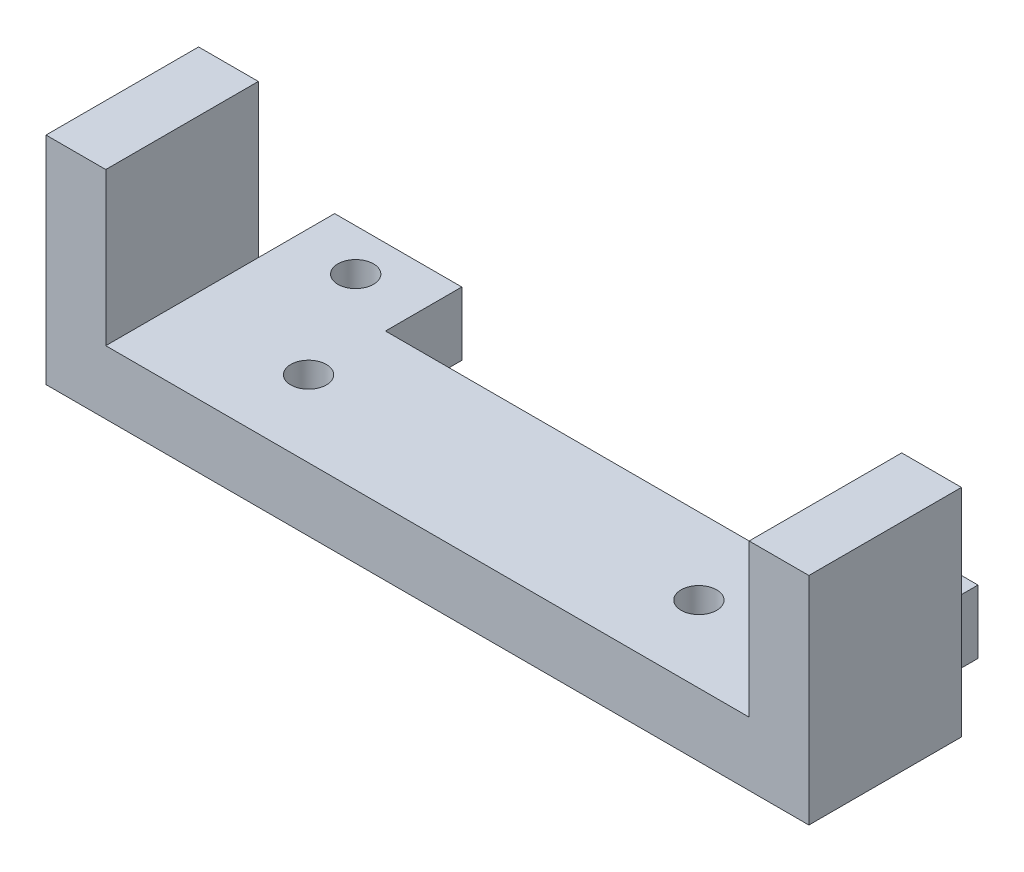
ISO-10303-21;
HEADER;
FILE_DESCRIPTION(('STEP AP214'),'2;1');
FILE_NAME('part.step','',(''),(''),'','','');
FILE_SCHEMA(('AUTOMOTIVE_DESIGN { 1 0 10303 214 1 1 1 1 }'));
ENDSEC;
DATA;
#1=APPLICATION_CONTEXT('core data for automotive mechanical design processes');
#2=APPLICATION_PROTOCOL_DEFINITION('international standard','automotive_design',2000,#1);
#3=PRODUCT_CONTEXT('',#1,'mechanical');
#4=PRODUCT('Part','Part','',(#3));
#5=PRODUCT_RELATED_PRODUCT_CATEGORY('part','',(#4));
#6=PRODUCT_DEFINITION_FORMATION('','',#4);
#7=PRODUCT_DEFINITION_CONTEXT('part definition',#1,'design');
#8=PRODUCT_DEFINITION('design','',#6,#7);
#9=PRODUCT_DEFINITION_SHAPE('','',#8);
#10=(LENGTH_UNIT() NAMED_UNIT(*) SI_UNIT(.MILLI.,.METRE.));
#11=(NAMED_UNIT(*) PLANE_ANGLE_UNIT() SI_UNIT($,.RADIAN.));
#12=(NAMED_UNIT(*) SI_UNIT($,.STERADIAN.) SOLID_ANGLE_UNIT());
#13=UNCERTAINTY_MEASURE_WITH_UNIT(LENGTH_MEASURE(1.E-05),#10,'distance_accuracy_value','');
#14=(GEOMETRIC_REPRESENTATION_CONTEXT(3) GLOBAL_UNCERTAINTY_ASSIGNED_CONTEXT((#13)) GLOBAL_UNIT_ASSIGNED_CONTEXT((#10,
#11,#12)) REPRESENTATION_CONTEXT('',''));
#15=CARTESIAN_POINT('',(0.,0.,0.));
#16=DIRECTION('',(0.,0.,1.));
#17=DIRECTION('',(1.,0.,0.));
#18=AXIS2_PLACEMENT_3D('',#15,#16,#17);
#19=CARTESIAN_POINT('',(-30.,5.,-6.));
#20=DIRECTION('',(0.,0.,1.));
#21=DIRECTION('',(1.,0.,0.));
#22=AXIS2_PLACEMENT_3D('',#19,#20,#21);
#23=PLANE('',#22);
#24=DIRECTION('',(0.,1.,0.));
#25=VECTOR('',#24,1.);
#26=CARTESIAN_POINT('',(-25.3,0.,-6.));
#27=LINE('',#26,#25);
#28=CARTESIAN_POINT('',(-25.3,0.,-6.));
#29=VERTEX_POINT('',#28);
#30=CARTESIAN_POINT('',(-25.3,5.,-6.));
#31=VERTEX_POINT('',#30);
#32=EDGE_CURVE('E153',#29,#31,#27,.T.);
#33=ORIENTED_EDGE('',*,*,#32,.F.);
#34=DIRECTION('',(-1.,0.,0.));
#35=VECTOR('',#34,1.);
#36=CARTESIAN_POINT('',(-30.,0.,-6.));
#37=LINE('',#36,#35);
#38=CARTESIAN_POINT('',(-30.,0.,-6.));
#39=VERTEX_POINT('',#38);
#40=EDGE_CURVE('E164',#29,#39,#37,.T.);
#41=ORIENTED_EDGE('',*,*,#40,.T.);
#42=DIRECTION('',(0.,-1.,0.));
#43=VECTOR('',#42,1.);
#44=CARTESIAN_POINT('',(-30.,5.,-6.));
#45=LINE('',#44,#43);
#46=CARTESIAN_POINT('',(-30.,17.,-6.));
#47=VERTEX_POINT('',#46);
#48=EDGE_CURVE('E200',#47,#39,#45,.T.);
#49=ORIENTED_EDGE('',*,*,#48,.F.);
#50=DIRECTION('',(-1.,0.,0.));
#51=VECTOR('',#50,1.);
#52=CARTESIAN_POINT('',(-30.,17.,-6.));
#53=LINE('',#52,#51);
#54=CARTESIAN_POINT('',(-25.3,17.,-6.));
#55=VERTEX_POINT('',#54);
#56=EDGE_CURVE('E251',#55,#47,#53,.T.);
#57=ORIENTED_EDGE('',*,*,#56,.F.);
#58=DIRECTION('',(0.,-1.,0.));
#59=VECTOR('',#58,1.);
#60=CARTESIAN_POINT('',(-25.3,17.,-6.));
#61=LINE('',#60,#59);
#62=EDGE_CURVE('E169',#55,#31,#61,.T.);
#63=ORIENTED_EDGE('',*,*,#62,.T.);
#64=EDGE_LOOP('',(#33,#41,#49,#57,#63));
#65=FACE_BOUND('',#64,.T.);
#66=ADVANCED_FACE('F43',(#65),#23,.F.);
#67=CARTESIAN_POINT('',(15.3,0.,-6.));
#68=VERTEX_POINT('',#67);
#69=CARTESIAN_POINT('',(-15.3,0.,-6.));
#70=VERTEX_POINT('',#69);
#71=EDGE_CURVE('E180',#68,#70,#37,.T.);
#72=ORIENTED_EDGE('',*,*,#71,.T.);
#73=DIRECTION('',(0.,1.,0.));
#74=VECTOR('',#73,1.);
#75=CARTESIAN_POINT('',(-15.3,0.,-6.));
#76=LINE('',#75,#74);
#77=CARTESIAN_POINT('',(-15.3,5.,-6.));
#78=VERTEX_POINT('',#77);
#79=EDGE_CURVE('E167',#70,#78,#76,.T.);
#80=ORIENTED_EDGE('',*,*,#79,.T.);
#81=DIRECTION('',(-1.,0.,0.));
#82=VECTOR('',#81,1.);
#83=CARTESIAN_POINT('',(-30.,5.,-6.));
#84=LINE('',#83,#82);
#85=CARTESIAN_POINT('',(15.3,5.,-6.));
#86=VERTEX_POINT('',#85);
#87=EDGE_CURVE('E188',#86,#78,#84,.T.);
#88=ORIENTED_EDGE('',*,*,#87,.F.);
#89=DIRECTION('',(0.,1.,0.));
#90=VECTOR('',#89,1.);
#91=CARTESIAN_POINT('',(15.3,0.,-6.));
#92=LINE('',#91,#90);
#93=EDGE_CURVE('E292',#68,#86,#92,.T.);
#94=ORIENTED_EDGE('',*,*,#93,.F.);
#95=EDGE_LOOP('',(#72,#80,#88,#94));
#96=FACE_BOUND('',#95,.T.);
#97=ADVANCED_FACE('F314',(#96),#23,.F.);
#98=CARTESIAN_POINT('',(-30.,5.,-6.));
#99=DIRECTION('',(1.,0.,0.));
#100=DIRECTION('',(0.,0.,-1.));
#101=AXIS2_PLACEMENT_3D('',#98,#99,#100);
#102=PLANE('',#101);
#103=DIRECTION('',(0.,0.,1.));
#104=VECTOR('',#103,1.);
#105=CARTESIAN_POINT('',(-30.,0.,-6.));
#106=LINE('',#105,#104);
#107=CARTESIAN_POINT('',(-30.,0.,6.));
#108=VERTEX_POINT('',#107);
#109=EDGE_CURVE('E176',#39,#108,#106,.T.);
#110=ORIENTED_EDGE('',*,*,#109,.T.);
#111=DIRECTION('',(0.,-1.,0.));
#112=VECTOR('',#111,1.);
#113=CARTESIAN_POINT('',(-30.,5.,6.));
#114=LINE('',#113,#112);
#115=CARTESIAN_POINT('',(-30.,17.,6.));
#116=VERTEX_POINT('',#115);
#117=EDGE_CURVE('E11',#116,#108,#114,.T.);
#118=ORIENTED_EDGE('',*,*,#117,.F.);
#119=DIRECTION('',(0.,0.,1.));
#120=VECTOR('',#119,1.);
#121=CARTESIAN_POINT('',(-30.,17.,-6.));
#122=LINE('',#121,#120);
#123=EDGE_CURVE('E246',#47,#116,#122,.T.);
#124=ORIENTED_EDGE('',*,*,#123,.F.);
#125=ORIENTED_EDGE('',*,*,#48,.T.);
#126=EDGE_LOOP('',(#110,#118,#124,#125));
#127=FACE_BOUND('',#126,.T.);
#128=ADVANCED_FACE('F44',(#127),#102,.F.);
#129=CARTESIAN_POINT('',(-30.,5.,6.));
#130=DIRECTION('',(0.,0.,-1.));
#131=DIRECTION('',(-1.,0.,0.));
#132=AXIS2_PLACEMENT_3D('',#129,#130,#131);
#133=PLANE('',#132);
#134=DIRECTION('',(1.,0.,0.));
#135=VECTOR('',#134,1.);
#136=CARTESIAN_POINT('',(-30.,0.,6.));
#137=LINE('',#136,#135);
#138=CARTESIAN_POINT('',(30.,0.,6.));
#139=VERTEX_POINT('',#138);
#140=EDGE_CURVE('E185',#108,#139,#137,.T.);
#141=ORIENTED_EDGE('',*,*,#140,.T.);
#142=DIRECTION('',(0.,-1.,0.));
#143=VECTOR('',#142,1.);
#144=CARTESIAN_POINT('',(30.,5.,6.));
#145=LINE('',#144,#143);
#146=CARTESIAN_POINT('',(30.,17.,6.));
#147=VERTEX_POINT('',#146);
#148=EDGE_CURVE('E51',#147,#139,#145,.T.);
#149=ORIENTED_EDGE('',*,*,#148,.F.);
#150=DIRECTION('',(1.,0.,0.));
#151=VECTOR('',#150,1.);
#152=CARTESIAN_POINT('',(25.3,17.,6.));
#153=LINE('',#152,#151);
#154=CARTESIAN_POINT('',(25.3,17.,6.));
#155=VERTEX_POINT('',#154);
#156=EDGE_CURVE('E272',#155,#147,#153,.T.);
#157=ORIENTED_EDGE('',*,*,#156,.F.);
#158=DIRECTION('',(0.,-1.,0.));
#159=VECTOR('',#158,1.);
#160=CARTESIAN_POINT('',(25.3,17.,6.));
#161=LINE('',#160,#159);
#162=CARTESIAN_POINT('',(25.3,5.,6.));
#163=VERTEX_POINT('',#162);
#164=EDGE_CURVE('E244',#155,#163,#161,.T.);
#165=ORIENTED_EDGE('',*,*,#164,.T.);
#166=DIRECTION('',(1.,0.,0.));
#167=VECTOR('',#166,1.);
#168=CARTESIAN_POINT('',(-30.,5.,6.));
#169=LINE('',#168,#167);
#170=CARTESIAN_POINT('',(-25.3,5.,6.));
#171=VERTEX_POINT('',#170);
#172=EDGE_CURVE('E187',#171,#163,#169,.T.);
#173=ORIENTED_EDGE('',*,*,#172,.F.);
#174=DIRECTION('',(0.,-1.,0.));
#175=VECTOR('',#174,1.);
#176=CARTESIAN_POINT('',(-25.3,17.,6.));
#177=LINE('',#176,#175);
#178=CARTESIAN_POINT('',(-25.3,17.,6.));
#179=VERTEX_POINT('',#178);
#180=EDGE_CURVE('E203',#179,#171,#177,.T.);
#181=ORIENTED_EDGE('',*,*,#180,.F.);
#182=DIRECTION('',(1.,0.,0.));
#183=VECTOR('',#182,1.);
#184=CARTESIAN_POINT('',(-30.,17.,6.));
#185=LINE('',#184,#183);
#186=EDGE_CURVE('E248',#116,#179,#185,.T.);
#187=ORIENTED_EDGE('',*,*,#186,.F.);
#188=ORIENTED_EDGE('',*,*,#117,.T.);
#189=EDGE_LOOP('',(#141,#149,#157,#165,#173,#181,#187,#188));
#190=FACE_BOUND('',#189,.T.);
#191=ADVANCED_FACE('F210',(#190),#133,.F.);
#192=CARTESIAN_POINT('',(30.,5.,-6.));
#193=DIRECTION('',(-1.,0.,0.));
#194=DIRECTION('',(0.,0.,1.));
#195=AXIS2_PLACEMENT_3D('',#192,#193,#194);
#196=PLANE('',#195);
#197=DIRECTION('',(0.,0.,-1.));
#198=VECTOR('',#197,1.);
#199=CARTESIAN_POINT('',(30.,0.,-6.));
#200=LINE('',#199,#198);
#201=CARTESIAN_POINT('',(30.,0.,-6.));
#202=VERTEX_POINT('',#201);
#203=EDGE_CURVE('E178',#139,#202,#200,.T.);
#204=ORIENTED_EDGE('',*,*,#203,.T.);
#205=DIRECTION('',(0.,-1.,0.));
#206=VECTOR('',#205,1.);
#207=CARTESIAN_POINT('',(30.,5.,-6.));
#208=LINE('',#207,#206);
#209=CARTESIAN_POINT('',(30.,17.,-6.));
#210=VERTEX_POINT('',#209);
#211=EDGE_CURVE('E217',#210,#202,#208,.T.);
#212=ORIENTED_EDGE('',*,*,#211,.F.);
#213=DIRECTION('',(0.,0.,-1.));
#214=VECTOR('',#213,1.);
#215=CARTESIAN_POINT('',(30.,17.,-6.));
#216=LINE('',#215,#214);
#217=EDGE_CURVE('E213',#147,#210,#216,.T.);
#218=ORIENTED_EDGE('',*,*,#217,.F.);
#219=ORIENTED_EDGE('',*,*,#148,.T.);
#220=EDGE_LOOP('',(#204,#212,#218,#219));
#221=FACE_BOUND('',#220,.T.);
#222=ADVANCED_FACE('F214',(#221),#196,.F.);
#223=CARTESIAN_POINT('',(25.3,0.,-6.));
#224=VERTEX_POINT('',#223);
#225=EDGE_CURVE('E179',#202,#224,#37,.T.);
#226=ORIENTED_EDGE('',*,*,#225,.T.);
#227=DIRECTION('',(0.,1.,0.));
#228=VECTOR('',#227,1.);
#229=CARTESIAN_POINT('',(25.3,0.,-6.));
#230=LINE('',#229,#228);
#231=CARTESIAN_POINT('',(25.3,5.,-6.));
#232=VERTEX_POINT('',#231);
#233=EDGE_CURVE('E293',#224,#232,#230,.T.);
#234=ORIENTED_EDGE('',*,*,#233,.T.);
#235=DIRECTION('',(0.,-1.,0.));
#236=VECTOR('',#235,1.);
#237=CARTESIAN_POINT('',(25.3,17.,-6.));
#238=LINE('',#237,#236);
#239=CARTESIAN_POINT('',(25.3,17.,-6.));
#240=VERTEX_POINT('',#239);
#241=EDGE_CURVE('E264',#240,#232,#238,.T.);
#242=ORIENTED_EDGE('',*,*,#241,.F.);
#243=DIRECTION('',(-1.,0.,0.));
#244=VECTOR('',#243,1.);
#245=CARTESIAN_POINT('',(25.3,17.,-6.));
#246=LINE('',#245,#244);
#247=EDGE_CURVE('E267',#210,#240,#246,.T.);
#248=ORIENTED_EDGE('',*,*,#247,.F.);
#249=ORIENTED_EDGE('',*,*,#211,.T.);
#250=EDGE_LOOP('',(#226,#234,#242,#248,#249));
#251=FACE_BOUND('',#250,.T.);
#252=ADVANCED_FACE('F290',(#251),#23,.F.);
#253=CARTESIAN_POINT('',(0.,5.,0.));
#254=DIRECTION('',(0.,1.,0.));
#255=DIRECTION('',(0.,0.,1.));
#256=AXIS2_PLACEMENT_3D('',#253,#254,#255);
#257=PLANE('',#256);
#258=CARTESIAN_POINT('',(-20.35,5.,-8.70662265696385));
#259=DIRECTION('',(0.,1.,0.));
#260=DIRECTION('',(0.,0.,1.));
#261=AXIS2_PLACEMENT_3D('',#258,#259,#260);
#262=CIRCLE('',#261,1.39999999999999);
#263=CARTESIAN_POINT('',(-20.35,5.,-7.30662265696386));
#264=VERTEX_POINT('',#263);
#265=EDGE_CURVE('E332',#264,#264,#262,.T.);
#266=ORIENTED_EDGE('',*,*,#265,.F.);
#267=EDGE_LOOP('',(#266));
#268=FACE_BOUND('',#267,.T.);
#269=CARTESIAN_POINT('',(20.35,5.,-8.70662265696385));
#270=DIRECTION('',(0.,1.,0.));
#271=DIRECTION('',(0.,0.,1.));
#272=AXIS2_PLACEMENT_3D('',#269,#270,#271);
#273=CIRCLE('',#272,1.39999999999999);
#274=CARTESIAN_POINT('',(20.35,5.,-7.30662265696386));
#275=VERTEX_POINT('',#274);
#276=EDGE_CURVE('E291',#275,#275,#273,.T.);
#277=ORIENTED_EDGE('',*,*,#276,.F.);
#278=EDGE_LOOP('',(#277));
#279=FACE_BOUND('',#278,.T.);
#280=CARTESIAN_POINT('',(15.35,5.,0.));
#281=DIRECTION('',(0.,1.,0.));
#282=DIRECTION('',(0.,0.,1.));
#283=AXIS2_PLACEMENT_3D('',#280,#281,#282);
#284=CIRCLE('',#283,1.39999999999999);
#285=CARTESIAN_POINT('',(15.35,5.,1.39999999999999));
#286=VERTEX_POINT('',#285);
#287=EDGE_CURVE('E236',#286,#286,#284,.T.);
#288=ORIENTED_EDGE('',*,*,#287,.F.);
#289=EDGE_LOOP('',(#288));
#290=FACE_BOUND('',#289,.T.);
#291=CARTESIAN_POINT('',(-15.35,5.,0.));
#292=DIRECTION('',(0.,1.,0.));
#293=DIRECTION('',(0.,0.,1.));
#294=AXIS2_PLACEMENT_3D('',#291,#292,#293);
#295=CIRCLE('',#294,1.39999999999999);
#296=CARTESIAN_POINT('',(-15.35,5.,1.39999999999999));
#297=VERTEX_POINT('',#296);
#298=EDGE_CURVE('E245',#297,#297,#295,.T.);
#299=ORIENTED_EDGE('',*,*,#298,.F.);
#300=EDGE_LOOP('',(#299));
#301=FACE_BOUND('',#300,.T.);
#302=DIRECTION('',(0.,0.,-1.));
#303=VECTOR('',#302,1.);
#304=CARTESIAN_POINT('',(-25.3,5.,-6.));
#305=LINE('',#304,#303);
#306=EDGE_CURVE('E249',#171,#31,#305,.T.);
#307=ORIENTED_EDGE('',*,*,#306,.F.);
#308=ORIENTED_EDGE('',*,*,#172,.T.);
#309=DIRECTION('',(0.,0.,1.));
#310=VECTOR('',#309,1.);
#311=CARTESIAN_POINT('',(25.3,5.,-6.));
#312=LINE('',#311,#310);
#313=EDGE_CURVE('E256',#232,#163,#312,.T.);
#314=ORIENTED_EDGE('',*,*,#313,.F.);
#315=DIRECTION('',(0.,0.,-1.));
#316=VECTOR('',#315,1.);
#317=CARTESIAN_POINT('',(25.3,5.,-6.));
#318=LINE('',#317,#316);
#319=CARTESIAN_POINT('',(25.3,5.,-12.));
#320=VERTEX_POINT('',#319);
#321=EDGE_CURVE('E67',#232,#320,#318,.T.);
#322=ORIENTED_EDGE('',*,*,#321,.T.);
#323=DIRECTION('',(-1.,0.,0.));
#324=VECTOR('',#323,1.);
#325=CARTESIAN_POINT('',(25.3,5.,-12.));
#326=LINE('',#325,#324);
#327=CARTESIAN_POINT('',(15.3,5.,-12.));
#328=VERTEX_POINT('',#327);
#329=EDGE_CURVE('E227',#320,#328,#326,.T.);
#330=ORIENTED_EDGE('',*,*,#329,.T.);
#331=DIRECTION('',(0.,0.,1.));
#332=VECTOR('',#331,1.);
#333=CARTESIAN_POINT('',(15.3,5.,-6.));
#334=LINE('',#333,#332);
#335=EDGE_CURVE('E223',#328,#86,#334,.T.);
#336=ORIENTED_EDGE('',*,*,#335,.T.);
#337=ORIENTED_EDGE('',*,*,#87,.T.);
#338=DIRECTION('',(0.,0.,-1.));
#339=VECTOR('',#338,1.);
#340=CARTESIAN_POINT('',(-15.3,5.,-6.));
#341=LINE('',#340,#339);
#342=CARTESIAN_POINT('',(-15.3,5.,-12.));
#343=VERTEX_POINT('',#342);
#344=EDGE_CURVE('E59',#78,#343,#341,.T.);
#345=ORIENTED_EDGE('',*,*,#344,.T.);
#346=DIRECTION('',(-1.,0.,0.));
#347=VECTOR('',#346,1.);
#348=CARTESIAN_POINT('',(-25.3,5.,-12.));
#349=LINE('',#348,#347);
#350=CARTESIAN_POINT('',(-25.3,5.,-12.));
#351=VERTEX_POINT('',#350);
#352=EDGE_CURVE('E163',#343,#351,#349,.T.);
#353=ORIENTED_EDGE('',*,*,#352,.T.);
#354=DIRECTION('',(0.,0.,1.));
#355=VECTOR('',#354,1.);
#356=CARTESIAN_POINT('',(-25.3,5.,-6.));
#357=LINE('',#356,#355);
#358=EDGE_CURVE('E296',#351,#31,#357,.T.);
#359=ORIENTED_EDGE('',*,*,#358,.T.);
#360=EDGE_LOOP('',(#307,#308,#314,#322,#330,#336,#337,#345,#353,#359));
#361=FACE_BOUND('',#360,.T.);
#362=ADVANCED_FACE('F294',(#268,#279,#290,#301,#361),#257,.T.);
#363=CARTESIAN_POINT('',(0.,0.,0.));
#364=DIRECTION('',(0.,1.,0.));
#365=DIRECTION('',(0.,0.,1.));
#366=AXIS2_PLACEMENT_3D('',#363,#364,#365);
#367=PLANE('',#366);
#368=CARTESIAN_POINT('',(-20.35,0.,-8.70662265696385));
#369=DIRECTION('',(0.,-1.,0.));
#370=DIRECTION('',(0.,0.,-1.));
#371=AXIS2_PLACEMENT_3D('',#368,#369,#370);
#372=CIRCLE('',#371,1.39999999999999);
#373=CARTESIAN_POINT('',(-20.35,0.,-10.1066226569638));
#374=VERTEX_POINT('',#373);
#375=EDGE_CURVE('E335',#374,#374,#372,.T.);
#376=ORIENTED_EDGE('',*,*,#375,.F.);
#377=EDGE_LOOP('',(#376));
#378=FACE_BOUND('',#377,.T.);
#379=CARTESIAN_POINT('',(20.35,0.,-8.70662265696385));
#380=DIRECTION('',(0.,-1.,0.));
#381=DIRECTION('',(0.,0.,-1.));
#382=AXIS2_PLACEMENT_3D('',#379,#380,#381);
#383=CIRCLE('',#382,1.39999999999999);
#384=CARTESIAN_POINT('',(20.35,0.,-10.1066226569638));
#385=VERTEX_POINT('',#384);
#386=EDGE_CURVE('E329',#385,#385,#383,.T.);
#387=ORIENTED_EDGE('',*,*,#386,.F.);
#388=EDGE_LOOP('',(#387));
#389=FACE_BOUND('',#388,.T.);
#390=CARTESIAN_POINT('',(15.35,0.,0.));
#391=DIRECTION('',(0.,-1.,0.));
#392=DIRECTION('',(0.,0.,-1.));
#393=AXIS2_PLACEMENT_3D('',#390,#391,#392);
#394=CIRCLE('',#393,1.39999999999999);
#395=CARTESIAN_POINT('',(15.35,0.,-1.39999999999999));
#396=VERTEX_POINT('',#395);
#397=EDGE_CURVE('E231',#396,#396,#394,.T.);
#398=ORIENTED_EDGE('',*,*,#397,.F.);
#399=EDGE_LOOP('',(#398));
#400=FACE_BOUND('',#399,.T.);
#401=CARTESIAN_POINT('',(-15.35,0.,0.));
#402=DIRECTION('',(0.,-1.,0.));
#403=DIRECTION('',(0.,0.,-1.));
#404=AXIS2_PLACEMENT_3D('',#401,#402,#403);
#405=CIRCLE('',#404,1.39999999999999);
#406=CARTESIAN_POINT('',(-15.35,0.,-1.39999999999999));
#407=VERTEX_POINT('',#406);
#408=EDGE_CURVE('E237',#407,#407,#405,.T.);
#409=ORIENTED_EDGE('',*,*,#408,.F.);
#410=EDGE_LOOP('',(#409));
#411=FACE_BOUND('',#410,.T.);
#412=ORIENTED_EDGE('',*,*,#109,.F.);
#413=ORIENTED_EDGE('',*,*,#40,.F.);
#414=DIRECTION('',(0.,0.,1.));
#415=VECTOR('',#414,1.);
#416=CARTESIAN_POINT('',(-25.3,0.,-6.));
#417=LINE('',#416,#415);
#418=CARTESIAN_POINT('',(-25.3,0.,-12.));
#419=VERTEX_POINT('',#418);
#420=EDGE_CURVE('E146',#419,#29,#417,.T.);
#421=ORIENTED_EDGE('',*,*,#420,.F.);
#422=DIRECTION('',(-1.,0.,0.));
#423=VECTOR('',#422,1.);
#424=CARTESIAN_POINT('',(-25.3,0.,-12.));
#425=LINE('',#424,#423);
#426=CARTESIAN_POINT('',(-15.3,0.,-12.));
#427=VERTEX_POINT('',#426);
#428=EDGE_CURVE('E171',#427,#419,#425,.T.);
#429=ORIENTED_EDGE('',*,*,#428,.F.);
#430=DIRECTION('',(0.,0.,-1.));
#431=VECTOR('',#430,1.);
#432=CARTESIAN_POINT('',(-15.3,0.,-6.));
#433=LINE('',#432,#431);
#434=EDGE_CURVE('E160',#70,#427,#433,.T.);
#435=ORIENTED_EDGE('',*,*,#434,.F.);
#436=ORIENTED_EDGE('',*,*,#71,.F.);
#437=DIRECTION('',(0.,0.,1.));
#438=VECTOR('',#437,1.);
#439=CARTESIAN_POINT('',(15.3,0.,-6.));
#440=LINE('',#439,#438);
#441=CARTESIAN_POINT('',(15.3,0.,-12.));
#442=VERTEX_POINT('',#441);
#443=EDGE_CURVE('E230',#442,#68,#440,.T.);
#444=ORIENTED_EDGE('',*,*,#443,.F.);
#445=DIRECTION('',(-1.,0.,0.));
#446=VECTOR('',#445,1.);
#447=CARTESIAN_POINT('',(25.3,0.,-12.));
#448=LINE('',#447,#446);
#449=CARTESIAN_POINT('',(25.3,0.,-12.));
#450=VERTEX_POINT('',#449);
#451=EDGE_CURVE('E224',#450,#442,#448,.T.);
#452=ORIENTED_EDGE('',*,*,#451,.F.);
#453=DIRECTION('',(0.,0.,-1.));
#454=VECTOR('',#453,1.);
#455=CARTESIAN_POINT('',(25.3,0.,-6.));
#456=LINE('',#455,#454);
#457=EDGE_CURVE('E216',#224,#450,#456,.T.);
#458=ORIENTED_EDGE('',*,*,#457,.F.);
#459=ORIENTED_EDGE('',*,*,#225,.F.);
#460=ORIENTED_EDGE('',*,*,#203,.F.);
#461=ORIENTED_EDGE('',*,*,#140,.F.);
#462=EDGE_LOOP('',(#412,#413,#421,#429,#435,#436,#444,#452,#458,#459,#460,#461));
#463=FACE_BOUND('',#462,.T.);
#464=ADVANCED_FACE('F172',(#378,#389,#400,#411,#463),#367,.F.);
#465=CARTESIAN_POINT('',(25.3,17.,-6.));
#466=DIRECTION('',(1.,0.,0.));
#467=DIRECTION('',(0.,0.,-1.));
#468=AXIS2_PLACEMENT_3D('',#465,#466,#467);
#469=PLANE('',#468);
#470=ORIENTED_EDGE('',*,*,#313,.T.);
#471=ORIENTED_EDGE('',*,*,#164,.F.);
#472=DIRECTION('',(0.,0.,1.));
#473=VECTOR('',#472,1.);
#474=CARTESIAN_POINT('',(25.3,17.,-6.));
#475=LINE('',#474,#473);
#476=EDGE_CURVE('E196',#240,#155,#475,.T.);
#477=ORIENTED_EDGE('',*,*,#476,.F.);
#478=ORIENTED_EDGE('',*,*,#241,.T.);
#479=EDGE_LOOP('',(#470,#471,#477,#478));
#480=FACE_BOUND('',#479,.T.);
#481=ADVANCED_FACE('F278',(#480),#469,.F.);
#482=CARTESIAN_POINT('',(0.,17.,0.));
#483=DIRECTION('',(0.,1.,0.));
#484=DIRECTION('',(0.,0.,1.));
#485=AXIS2_PLACEMENT_3D('',#482,#483,#484);
#486=PLANE('',#485);
#487=ORIENTED_EDGE('',*,*,#476,.T.);
#488=ORIENTED_EDGE('',*,*,#156,.T.);
#489=ORIENTED_EDGE('',*,*,#217,.T.);
#490=ORIENTED_EDGE('',*,*,#247,.T.);
#491=EDGE_LOOP('',(#487,#488,#489,#490));
#492=FACE_BOUND('',#491,.T.);
#493=ADVANCED_FACE('F277',(#492),#486,.T.);
#494=CARTESIAN_POINT('',(-25.3,17.,-6.));
#495=DIRECTION('',(-1.,0.,0.));
#496=DIRECTION('',(0.,0.,1.));
#497=AXIS2_PLACEMENT_3D('',#494,#495,#496);
#498=PLANE('',#497);
#499=ORIENTED_EDGE('',*,*,#306,.T.);
#500=ORIENTED_EDGE('',*,*,#62,.F.);
#501=DIRECTION('',(0.,0.,-1.));
#502=VECTOR('',#501,1.);
#503=CARTESIAN_POINT('',(-25.3,17.,-6.));
#504=LINE('',#503,#502);
#505=EDGE_CURVE('E255',#179,#55,#504,.T.);
#506=ORIENTED_EDGE('',*,*,#505,.F.);
#507=ORIENTED_EDGE('',*,*,#180,.T.);
#508=EDGE_LOOP('',(#499,#500,#506,#507));
#509=FACE_BOUND('',#508,.T.);
#510=ADVANCED_FACE('F284',(#509),#498,.F.);
#511=CARTESIAN_POINT('',(0.,17.,0.));
#512=DIRECTION('',(0.,1.,0.));
#513=DIRECTION('',(0.,0.,1.));
#514=AXIS2_PLACEMENT_3D('',#511,#512,#513);
#515=PLANE('',#514);
#516=ORIENTED_EDGE('',*,*,#123,.T.);
#517=ORIENTED_EDGE('',*,*,#186,.T.);
#518=ORIENTED_EDGE('',*,*,#505,.T.);
#519=ORIENTED_EDGE('',*,*,#56,.T.);
#520=EDGE_LOOP('',(#516,#517,#518,#519));
#521=FACE_BOUND('',#520,.T.);
#522=ADVANCED_FACE('F286',(#521),#515,.T.);
#523=CARTESIAN_POINT('',(-15.35,0.,0.));
#524=DIRECTION('',(0.,-1.,0.));
#525=DIRECTION('',(0.,0.,-1.));
#526=AXIS2_PLACEMENT_3D('',#523,#524,#525);
#527=CYLINDRICAL_SURFACE('',#526,1.39999999999999);
#528=ORIENTED_EDGE('',*,*,#298,.T.);
#529=EDGE_LOOP('',(#528));
#530=FACE_BOUND('',#529,.T.);
#531=ORIENTED_EDGE('',*,*,#408,.T.);
#532=EDGE_LOOP('',(#531));
#533=FACE_BOUND('',#532,.T.);
#534=ADVANCED_FACE('F346',(#530,#533),#527,.F.);
#535=CARTESIAN_POINT('',(15.35,0.,0.));
#536=DIRECTION('',(0.,-1.,0.));
#537=DIRECTION('',(0.,0.,-1.));
#538=AXIS2_PLACEMENT_3D('',#535,#536,#537);
#539=CYLINDRICAL_SURFACE('',#538,1.39999999999999);
#540=ORIENTED_EDGE('',*,*,#287,.T.);
#541=EDGE_LOOP('',(#540));
#542=FACE_BOUND('',#541,.T.);
#543=ORIENTED_EDGE('',*,*,#397,.T.);
#544=EDGE_LOOP('',(#543));
#545=FACE_BOUND('',#544,.T.);
#546=ADVANCED_FACE('F352',(#542,#545),#539,.F.);
#547=CARTESIAN_POINT('',(25.3,0.,-6.));
#548=DIRECTION('',(1.,0.,0.));
#549=DIRECTION('',(0.,0.,-1.));
#550=AXIS2_PLACEMENT_3D('',#547,#548,#549);
#551=PLANE('',#550);
#552=ORIENTED_EDGE('',*,*,#321,.F.);
#553=ORIENTED_EDGE('',*,*,#233,.F.);
#554=ORIENTED_EDGE('',*,*,#457,.T.);
#555=DIRECTION('',(0.,1.,0.));
#556=VECTOR('',#555,1.);
#557=CARTESIAN_POINT('',(25.3,0.,-12.));
#558=LINE('',#557,#556);
#559=EDGE_CURVE('E305',#450,#320,#558,.T.);
#560=ORIENTED_EDGE('',*,*,#559,.T.);
#561=EDGE_LOOP('',(#552,#553,#554,#560));
#562=FACE_BOUND('',#561,.T.);
#563=ADVANCED_FACE('F360',(#562),#551,.T.);
#564=CARTESIAN_POINT('',(15.3,0.,-6.));
#565=DIRECTION('',(-1.,0.,0.));
#566=DIRECTION('',(0.,0.,1.));
#567=AXIS2_PLACEMENT_3D('',#564,#565,#566);
#568=PLANE('',#567);
#569=ORIENTED_EDGE('',*,*,#335,.F.);
#570=DIRECTION('',(0.,1.,0.));
#571=VECTOR('',#570,1.);
#572=CARTESIAN_POINT('',(15.3,0.,-12.));
#573=LINE('',#572,#571);
#574=EDGE_CURVE('E304',#442,#328,#573,.T.);
#575=ORIENTED_EDGE('',*,*,#574,.F.);
#576=ORIENTED_EDGE('',*,*,#443,.T.);
#577=ORIENTED_EDGE('',*,*,#93,.T.);
#578=EDGE_LOOP('',(#569,#575,#576,#577));
#579=FACE_BOUND('',#578,.T.);
#580=ADVANCED_FACE('F311',(#579),#568,.T.);
#581=CARTESIAN_POINT('',(25.3,0.,-12.));
#582=DIRECTION('',(0.,0.,-1.));
#583=DIRECTION('',(-1.,0.,0.));
#584=AXIS2_PLACEMENT_3D('',#581,#582,#583);
#585=PLANE('',#584);
#586=ORIENTED_EDGE('',*,*,#329,.F.);
#587=ORIENTED_EDGE('',*,*,#559,.F.);
#588=ORIENTED_EDGE('',*,*,#451,.T.);
#589=ORIENTED_EDGE('',*,*,#574,.T.);
#590=EDGE_LOOP('',(#586,#587,#588,#589));
#591=FACE_BOUND('',#590,.T.);
#592=ADVANCED_FACE('F519',(#591),#585,.T.);
#593=CARTESIAN_POINT('',(-25.3,0.,-6.));
#594=DIRECTION('',(-1.,0.,0.));
#595=DIRECTION('',(0.,0.,1.));
#596=AXIS2_PLACEMENT_3D('',#593,#594,#595);
#597=PLANE('',#596);
#598=ORIENTED_EDGE('',*,*,#358,.F.);
#599=DIRECTION('',(0.,1.,0.));
#600=VECTOR('',#599,1.);
#601=CARTESIAN_POINT('',(-25.3,0.,-12.));
#602=LINE('',#601,#600);
#603=EDGE_CURVE('E151',#419,#351,#602,.T.);
#604=ORIENTED_EDGE('',*,*,#603,.F.);
#605=ORIENTED_EDGE('',*,*,#420,.T.);
#606=ORIENTED_EDGE('',*,*,#32,.T.);
#607=EDGE_LOOP('',(#598,#604,#605,#606));
#608=FACE_BOUND('',#607,.T.);
#609=ADVANCED_FACE('F155',(#608),#597,.T.);
#610=CARTESIAN_POINT('',(-25.3,0.,-12.));
#611=DIRECTION('',(0.,0.,-1.));
#612=DIRECTION('',(-1.,0.,0.));
#613=AXIS2_PLACEMENT_3D('',#610,#611,#612);
#614=PLANE('',#613);
#615=ORIENTED_EDGE('',*,*,#352,.F.);
#616=DIRECTION('',(0.,1.,0.));
#617=VECTOR('',#616,1.);
#618=CARTESIAN_POINT('',(-15.3,0.,-12.));
#619=LINE('',#618,#617);
#620=EDGE_CURVE('E319',#427,#343,#619,.T.);
#621=ORIENTED_EDGE('',*,*,#620,.F.);
#622=ORIENTED_EDGE('',*,*,#428,.T.);
#623=ORIENTED_EDGE('',*,*,#603,.T.);
#624=EDGE_LOOP('',(#615,#621,#622,#623));
#625=FACE_BOUND('',#624,.T.);
#626=ADVANCED_FACE('F537',(#625),#614,.T.);
#627=CARTESIAN_POINT('',(-15.3,0.,-6.));
#628=DIRECTION('',(1.,0.,0.));
#629=DIRECTION('',(0.,0.,-1.));
#630=AXIS2_PLACEMENT_3D('',#627,#628,#629);
#631=PLANE('',#630);
#632=ORIENTED_EDGE('',*,*,#344,.F.);
#633=ORIENTED_EDGE('',*,*,#79,.F.);
#634=ORIENTED_EDGE('',*,*,#434,.T.);
#635=ORIENTED_EDGE('',*,*,#620,.T.);
#636=EDGE_LOOP('',(#632,#633,#634,#635));
#637=FACE_BOUND('',#636,.T.);
#638=ADVANCED_FACE('F541',(#637),#631,.T.);
#639=CARTESIAN_POINT('',(20.35,0.,-8.70662265696385));
#640=DIRECTION('',(0.,-1.,0.));
#641=DIRECTION('',(0.,0.,-1.));
#642=AXIS2_PLACEMENT_3D('',#639,#640,#641);
#643=CYLINDRICAL_SURFACE('',#642,1.39999999999999);
#644=ORIENTED_EDGE('',*,*,#276,.T.);
#645=EDGE_LOOP('',(#644));
#646=FACE_BOUND('',#645,.T.);
#647=ORIENTED_EDGE('',*,*,#386,.T.);
#648=EDGE_LOOP('',(#647));
#649=FACE_BOUND('',#648,.T.);
#650=ADVANCED_FACE('F555',(#646,#649),#643,.F.);
#651=CARTESIAN_POINT('',(-20.35,0.,-8.70662265696385));
#652=DIRECTION('',(0.,-1.,0.));
#653=DIRECTION('',(0.,0.,-1.));
#654=AXIS2_PLACEMENT_3D('',#651,#652,#653);
#655=CYLINDRICAL_SURFACE('',#654,1.39999999999999);
#656=ORIENTED_EDGE('',*,*,#265,.T.);
#657=EDGE_LOOP('',(#656));
#658=FACE_BOUND('',#657,.T.);
#659=ORIENTED_EDGE('',*,*,#375,.T.);
#660=EDGE_LOOP('',(#659));
#661=FACE_BOUND('',#660,.T.);
#662=ADVANCED_FACE('F339',(#658,#661),#655,.F.);
#663=CLOSED_SHELL('',(#66,#97,#128,#191,#222,#252,#362,#464,#481,#493,#510,#522,#534,#546,#563,
#580,#592,#609,#626,#638,#650,#662));
#664=MANIFOLD_SOLID_BREP('B2',#663);
#665=ADVANCED_BREP_SHAPE_REPRESENTATION('',(#18,#664),#14);
#666=SHAPE_DEFINITION_REPRESENTATION(#9,#665);
ENDSEC;
END-ISO-10303-21;
